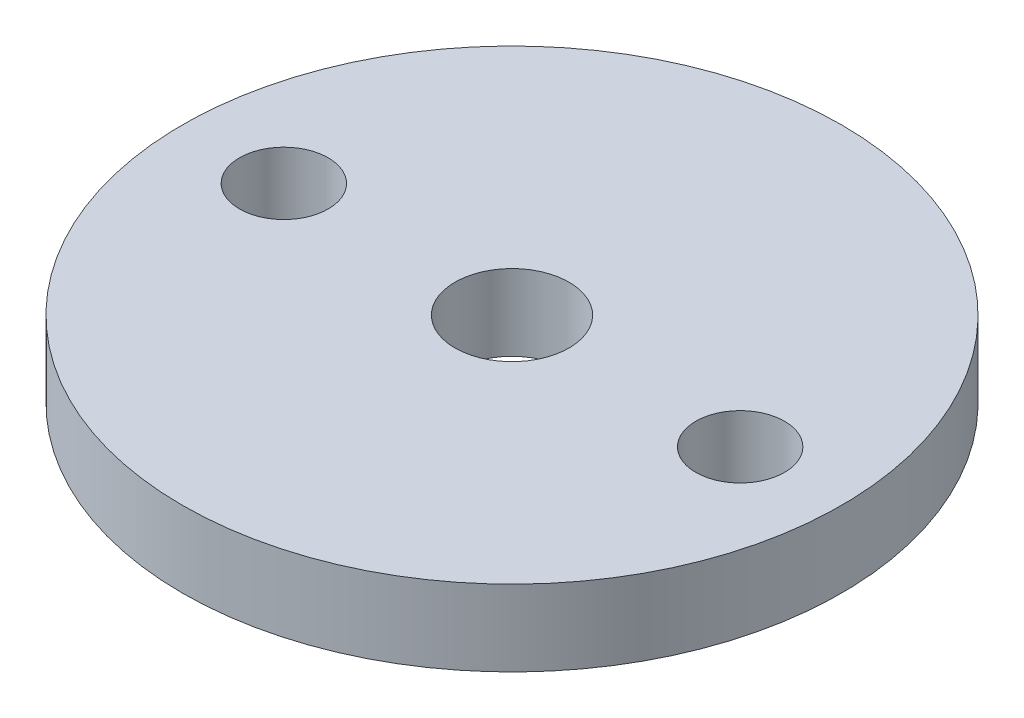
ISO-10303-21;
HEADER;
FILE_DESCRIPTION(('STEP AP214'),'2;1');
FILE_NAME('part.step','',(''),(''),'','','');
FILE_SCHEMA(('AUTOMOTIVE_DESIGN { 1 0 10303 214 1 1 1 1 }'));
ENDSEC;
DATA;
#1=APPLICATION_CONTEXT('core data for automotive mechanical design processes');
#2=APPLICATION_PROTOCOL_DEFINITION('international standard','automotive_design',2000,#1);
#3=PRODUCT_CONTEXT('',#1,'mechanical');
#4=PRODUCT('Part','Part','',(#3));
#5=PRODUCT_RELATED_PRODUCT_CATEGORY('part','',(#4));
#6=PRODUCT_DEFINITION_FORMATION('','',#4);
#7=PRODUCT_DEFINITION_CONTEXT('part definition',#1,'design');
#8=PRODUCT_DEFINITION('design','',#6,#7);
#9=PRODUCT_DEFINITION_SHAPE('','',#8);
#10=(LENGTH_UNIT() NAMED_UNIT(*) SI_UNIT(.MILLI.,.METRE.));
#11=(NAMED_UNIT(*) PLANE_ANGLE_UNIT() SI_UNIT($,.RADIAN.));
#12=(NAMED_UNIT(*) SI_UNIT($,.STERADIAN.) SOLID_ANGLE_UNIT());
#13=UNCERTAINTY_MEASURE_WITH_UNIT(LENGTH_MEASURE(1.E-05),#10,'distance_accuracy_value','');
#14=(GEOMETRIC_REPRESENTATION_CONTEXT(3) GLOBAL_UNCERTAINTY_ASSIGNED_CONTEXT((#13)) GLOBAL_UNIT_ASSIGNED_CONTEXT((#10,
#11,#12)) REPRESENTATION_CONTEXT('',''));
#15=CARTESIAN_POINT('',(0.,0.,0.));
#16=DIRECTION('',(0.,0.,1.));
#17=DIRECTION('',(1.,0.,0.));
#18=AXIS2_PLACEMENT_3D('',#15,#16,#17);
#19=CARTESIAN_POINT('',(0.,3.,0.));
#20=DIRECTION('',(0.,-1.,0.));
#21=DIRECTION('',(0.,0.,-1.));
#22=AXIS2_PLACEMENT_3D('',#19,#20,#21);
#23=CYLINDRICAL_SURFACE('',#22,13.);
#24=CARTESIAN_POINT('',(0.,3.,0.));
#25=DIRECTION('',(0.,1.,0.));
#26=DIRECTION('',(0.,0.,1.));
#27=AXIS2_PLACEMENT_3D('',#24,#25,#26);
#28=CIRCLE('',#27,13.);
#29=CARTESIAN_POINT('',(0.,3.,13.));
#30=VERTEX_POINT('',#29);
#31=EDGE_CURVE('E10',#30,#30,#28,.T.);
#32=ORIENTED_EDGE('',*,*,#31,.F.);
#33=EDGE_LOOP('',(#32));
#34=FACE_BOUND('',#33,.T.);
#35=CARTESIAN_POINT('',(0.,0.,0.));
#36=DIRECTION('',(0.,1.,0.));
#37=DIRECTION('',(0.,0.,1.));
#38=AXIS2_PLACEMENT_3D('',#35,#36,#37);
#39=CIRCLE('',#38,13.);
#40=CARTESIAN_POINT('',(0.,0.,13.));
#41=VERTEX_POINT('',#40);
#42=EDGE_CURVE('E40',#41,#41,#39,.T.);
#43=ORIENTED_EDGE('',*,*,#42,.T.);
#44=EDGE_LOOP('',(#43));
#45=FACE_BOUND('',#44,.T.);
#46=ADVANCED_FACE('F37',(#34,#45),#23,.T.);
#47=CARTESIAN_POINT('',(0.,3.,0.));
#48=DIRECTION('',(0.,1.,0.));
#49=DIRECTION('',(0.,0.,1.));
#50=AXIS2_PLACEMENT_3D('',#47,#48,#49);
#51=PLANE('',#50);
#52=CARTESIAN_POINT('',(-9.,3.,0.));
#53=DIRECTION('',(0.,-1.,0.));
#54=DIRECTION('',(0.,0.,1.));
#55=AXIS2_PLACEMENT_3D('',#52,#53,#54);
#56=CIRCLE('',#55,1.75);
#57=CARTESIAN_POINT('',(-9.,3.,1.75));
#58=VERTEX_POINT('',#57);
#59=EDGE_CURVE('E67',#58,#58,#56,.T.);
#60=ORIENTED_EDGE('',*,*,#59,.T.);
#61=EDGE_LOOP('',(#60));
#62=FACE_BOUND('',#61,.T.);
#63=CARTESIAN_POINT('',(9.,3.,0.));
#64=DIRECTION('',(0.,1.,0.));
#65=DIRECTION('',(0.,0.,1.));
#66=AXIS2_PLACEMENT_3D('',#63,#64,#65);
#67=CIRCLE('',#66,1.75);
#68=CARTESIAN_POINT('',(9.,3.,1.75));
#69=VERTEX_POINT('',#68);
#70=EDGE_CURVE('E59',#69,#69,#67,.T.);
#71=ORIENTED_EDGE('',*,*,#70,.F.);
#72=EDGE_LOOP('',(#71));
#73=FACE_BOUND('',#72,.T.);
#74=CARTESIAN_POINT('',(0.,3.,0.));
#75=DIRECTION('',(0.,1.,0.));
#76=DIRECTION('',(0.,0.,1.));
#77=AXIS2_PLACEMENT_3D('',#74,#75,#76);
#78=CIRCLE('',#77,2.25);
#79=CARTESIAN_POINT('',(0.,3.,2.25));
#80=VERTEX_POINT('',#79);
#81=EDGE_CURVE('E51',#80,#80,#78,.T.);
#82=ORIENTED_EDGE('',*,*,#81,.F.);
#83=EDGE_LOOP('',(#82));
#84=FACE_BOUND('',#83,.T.);
#85=ORIENTED_EDGE('',*,*,#31,.T.);
#86=EDGE_LOOP('',(#85));
#87=FACE_BOUND('',#86,.T.);
#88=ADVANCED_FACE('F82',(#62,#73,#84,#87),#51,.T.);
#89=CARTESIAN_POINT('',(0.,0.,0.));
#90=DIRECTION('',(0.,1.,0.));
#91=DIRECTION('',(0.,0.,1.));
#92=AXIS2_PLACEMENT_3D('',#89,#90,#91);
#93=PLANE('',#92);
#94=CARTESIAN_POINT('',(-9.,0.,0.));
#95=DIRECTION('',(0.,-1.,0.));
#96=DIRECTION('',(0.,0.,1.));
#97=AXIS2_PLACEMENT_3D('',#94,#95,#96);
#98=CIRCLE('',#97,1.75);
#99=CARTESIAN_POINT('',(-9.,0.,1.75));
#100=VERTEX_POINT('',#99);
#101=EDGE_CURVE('E63',#100,#100,#98,.T.);
#102=ORIENTED_EDGE('',*,*,#101,.F.);
#103=EDGE_LOOP('',(#102));
#104=FACE_BOUND('',#103,.T.);
#105=CARTESIAN_POINT('',(9.,0.,0.));
#106=DIRECTION('',(0.,1.,0.));
#107=DIRECTION('',(0.,0.,1.));
#108=AXIS2_PLACEMENT_3D('',#105,#106,#107);
#109=CIRCLE('',#108,1.75);
#110=CARTESIAN_POINT('',(9.,0.,1.75));
#111=VERTEX_POINT('',#110);
#112=EDGE_CURVE('E55',#111,#111,#109,.T.);
#113=ORIENTED_EDGE('',*,*,#112,.T.);
#114=EDGE_LOOP('',(#113));
#115=FACE_BOUND('',#114,.T.);
#116=CARTESIAN_POINT('',(0.,0.,0.));
#117=DIRECTION('',(0.,1.,0.));
#118=DIRECTION('',(0.,0.,1.));
#119=AXIS2_PLACEMENT_3D('',#116,#117,#118);
#120=CIRCLE('',#119,2.25);
#121=CARTESIAN_POINT('',(0.,0.,2.25));
#122=VERTEX_POINT('',#121);
#123=EDGE_CURVE('E49',#122,#122,#120,.T.);
#124=ORIENTED_EDGE('',*,*,#123,.T.);
#125=EDGE_LOOP('',(#124));
#126=FACE_BOUND('',#125,.T.);
#127=ORIENTED_EDGE('',*,*,#42,.F.);
#128=EDGE_LOOP('',(#127));
#129=FACE_BOUND('',#128,.T.);
#130=ADVANCED_FACE('F78',(#104,#115,#126,#129),#93,.F.);
#131=CARTESIAN_POINT('',(0.,0.,0.));
#132=DIRECTION('',(0.,1.,0.));
#133=DIRECTION('',(0.,0.,1.));
#134=AXIS2_PLACEMENT_3D('',#131,#132,#133);
#135=CYLINDRICAL_SURFACE('',#134,2.25);
#136=ORIENTED_EDGE('',*,*,#123,.F.);
#137=EDGE_LOOP('',(#136));
#138=FACE_BOUND('',#137,.T.);
#139=ORIENTED_EDGE('',*,*,#81,.T.);
#140=EDGE_LOOP('',(#139));
#141=FACE_BOUND('',#140,.T.);
#142=ADVANCED_FACE('F81',(#138,#141),#135,.F.);
#143=CARTESIAN_POINT('',(9.,0.,0.));
#144=DIRECTION('',(0.,1.,0.));
#145=DIRECTION('',(0.,0.,1.));
#146=AXIS2_PLACEMENT_3D('',#143,#144,#145);
#147=CYLINDRICAL_SURFACE('',#146,1.75);
#148=ORIENTED_EDGE('',*,*,#112,.F.);
#149=EDGE_LOOP('',(#148));
#150=FACE_BOUND('',#149,.T.);
#151=ORIENTED_EDGE('',*,*,#70,.T.);
#152=EDGE_LOOP('',(#151));
#153=FACE_BOUND('',#152,.T.);
#154=ADVANCED_FACE('F102',(#150,#153),#147,.F.);
#155=CARTESIAN_POINT('',(-9.,0.,0.));
#156=DIRECTION('',(0.,1.,0.));
#157=DIRECTION('',(0.,0.,1.));
#158=AXIS2_PLACEMENT_3D('',#155,#156,#157);
#159=CYLINDRICAL_SURFACE('',#158,1.75);
#160=ORIENTED_EDGE('',*,*,#101,.T.);
#161=EDGE_LOOP('',(#160));
#162=FACE_BOUND('',#161,.T.);
#163=ORIENTED_EDGE('',*,*,#59,.F.);
#164=EDGE_LOOP('',(#163));
#165=FACE_BOUND('',#164,.T.);
#166=ADVANCED_FACE('F75',(#162,#165),#159,.F.);
#167=CLOSED_SHELL('',(#46,#88,#130,#142,#154,#166));
#168=MANIFOLD_SOLID_BREP('B2',#167);
#169=ADVANCED_BREP_SHAPE_REPRESENTATION('',(#18,#168),#14);
#170=SHAPE_DEFINITION_REPRESENTATION(#9,#169);
ENDSEC;
END-ISO-10303-21;
